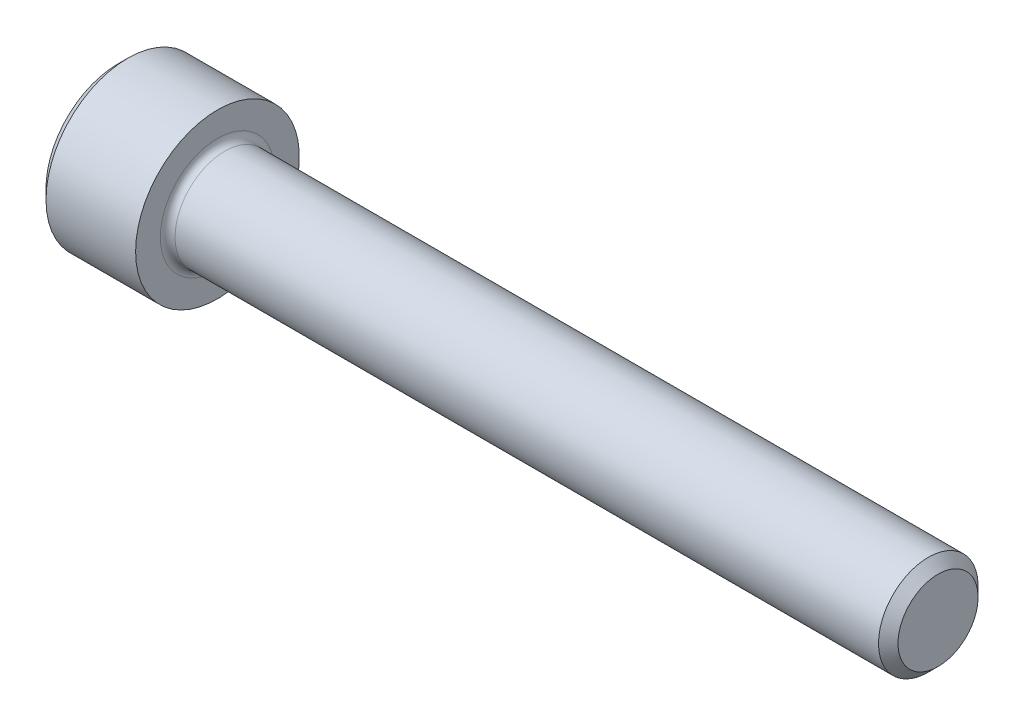
ISO-10303-21;
HEADER;
FILE_DESCRIPTION(('STEP AP214'),'2;1');
FILE_NAME('part.step','',(''),(''),'','','');
FILE_SCHEMA(('AUTOMOTIVE_DESIGN { 1 0 10303 214 1 1 1 1 }'));
ENDSEC;
DATA;
#1=APPLICATION_CONTEXT('core data for automotive mechanical design processes');
#2=APPLICATION_PROTOCOL_DEFINITION('international standard','automotive_design',2000,#1);
#3=PRODUCT_CONTEXT('',#1,'mechanical');
#4=PRODUCT('Part','Part','',(#3));
#5=PRODUCT_RELATED_PRODUCT_CATEGORY('part','',(#4));
#6=PRODUCT_DEFINITION_FORMATION('','',#4);
#7=PRODUCT_DEFINITION_CONTEXT('part definition',#1,'design');
#8=PRODUCT_DEFINITION('design','',#6,#7);
#9=PRODUCT_DEFINITION_SHAPE('','',#8);
#10=(LENGTH_UNIT() NAMED_UNIT(*) SI_UNIT(.MILLI.,.METRE.));
#11=(NAMED_UNIT(*) PLANE_ANGLE_UNIT() SI_UNIT($,.RADIAN.));
#12=(NAMED_UNIT(*) SI_UNIT($,.STERADIAN.) SOLID_ANGLE_UNIT());
#13=UNCERTAINTY_MEASURE_WITH_UNIT(LENGTH_MEASURE(1.E-05),#10,'distance_accuracy_value','');
#14=(GEOMETRIC_REPRESENTATION_CONTEXT(3) GLOBAL_UNCERTAINTY_ASSIGNED_CONTEXT((#13)) GLOBAL_UNIT_ASSIGNED_CONTEXT((#10,
#11,#12)) REPRESENTATION_CONTEXT('',''));
#15=CARTESIAN_POINT('',(0.,0.,0.));
#16=DIRECTION('',(0.,0.,1.));
#17=DIRECTION('',(1.,0.,0.));
#18=AXIS2_PLACEMENT_3D('',#15,#16,#17);
#19=CARTESIAN_POINT('',(2.286,1.14604605784411,1.98501));
#20=DIRECTION('',(-1.,0.,0.));
#21=DIRECTION('',(0.,0.,1.));
#22=AXIS2_PLACEMENT_3D('',#19,#20,#21);
#23=PLANE('',#22);
#24=DIRECTION('',(0.,0.500000000000001,0.866025403784438));
#25=VECTOR('',#24,1.);
#26=CARTESIAN_POINT('',(2.286,-1.71906908676614,0.992505));
#27=LINE('',#26,#25);
#28=CARTESIAN_POINT('',(2.2859999999804,-1.71906908679011,0.992505000013839));
#29=VERTEX_POINT('',#28);
#30=CARTESIAN_POINT('',(2.286,-1.14604605784409,1.98501));
#31=VERTEX_POINT('',#30);
#32=EDGE_CURVE('E101',#29,#31,#27,.T.);
#33=ORIENTED_EDGE('',*,*,#32,.T.);
#34=DIRECTION('',(0.,1.,0.));
#35=VECTOR('',#34,1.);
#36=CARTESIAN_POINT('',(2.286,1.14604605784411,1.98501));
#37=LINE('',#36,#35);
#38=CARTESIAN_POINT('',(2.28599999998701,0.,1.98501000001309));
#39=VERTEX_POINT('',#38);
#40=EDGE_CURVE('E96',#31,#39,#37,.T.);
#41=ORIENTED_EDGE('',*,*,#40,.T.);
#42=CARTESIAN_POINT('',(2.2859999999608,0.,0.));
#43=DIRECTION('',(-1.,0.,0.));
#44=DIRECTION('',(0.,0.,1.));
#45=AXIS2_PLACEMENT_3D('',#42,#43,#44);
#46=CIRCLE('',#45,1.98501000005535);
#47=EDGE_CURVE('E98',#39,#29,#46,.F.);
#48=ORIENTED_EDGE('',*,*,#47,.T.);
#49=EDGE_LOOP('',(#33,#41,#48));
#50=FACE_BOUND('',#49,.T.);
#51=ADVANCED_FACE('F17',(#50),#23,.T.);
#52=CARTESIAN_POINT('',(2.286,1.14604605784411,1.98501));
#53=DIRECTION('',(-1.,0.,0.));
#54=DIRECTION('',(0.,0.,1.));
#55=AXIS2_PLACEMENT_3D('',#52,#53,#54);
#56=PLANE('',#55);
#57=DIRECTION('',(0.,-0.499999999999998,0.86602540378444));
#58=VECTOR('',#57,1.);
#59=CARTESIAN_POINT('',(2.286,-1.71906908676615,-0.992504999999996));
#60=LINE('',#59,#58);
#61=CARTESIAN_POINT('',(2.2859999999804,-1.71906908679012,-0.992505000013836));
#62=VERTEX_POINT('',#61);
#63=CARTESIAN_POINT('',(2.286,-2.29209211568819,0.));
#64=VERTEX_POINT('',#63);
#65=EDGE_CURVE('E105',#62,#64,#60,.T.);
#66=ORIENTED_EDGE('',*,*,#65,.T.);
#67=DIRECTION('',(0.,0.500000000000001,0.866025403784438));
#68=VECTOR('',#67,1.);
#69=CARTESIAN_POINT('',(2.286,-2.29209211568819,0.));
#70=LINE('',#69,#68);
#71=EDGE_CURVE('E172',#64,#29,#70,.T.);
#72=ORIENTED_EDGE('',*,*,#71,.T.);
#73=CARTESIAN_POINT('',(2.2859999999608,0.,0.));
#74=DIRECTION('',(-1.,0.,0.));
#75=DIRECTION('',(0.,0.,1.));
#76=AXIS2_PLACEMENT_3D('',#73,#74,#75);
#77=CIRCLE('',#76,1.98501000005535);
#78=EDGE_CURVE('E117',#29,#62,#77,.F.);
#79=ORIENTED_EDGE('',*,*,#78,.T.);
#80=EDGE_LOOP('',(#66,#72,#79));
#81=FACE_BOUND('',#80,.T.);
#82=ADVANCED_FACE('F348',(#81),#56,.T.);
#83=CARTESIAN_POINT('',(2.286,1.14604605784411,1.98501));
#84=DIRECTION('',(-1.,0.,0.));
#85=DIRECTION('',(0.,0.,1.));
#86=AXIS2_PLACEMENT_3D('',#83,#84,#85);
#87=PLANE('',#86);
#88=DIRECTION('',(0.,1.,0.));
#89=VECTOR('',#88,1.);
#90=CARTESIAN_POINT('',(2.286,1.14604605784411,-1.98501));
#91=LINE('',#90,#89);
#92=CARTESIAN_POINT('',(2.28599999998701,3.76751918419413E-12,-1.98501000001309));
#93=VERTEX_POINT('',#92);
#94=CARTESIAN_POINT('',(2.286,-1.1460460578441,-1.98501));
#95=VERTEX_POINT('',#94);
#96=EDGE_CURVE('E167',#93,#95,#91,.F.);
#97=ORIENTED_EDGE('',*,*,#96,.T.);
#98=DIRECTION('',(0.,-0.499999999999999,0.866025403784439));
#99=VECTOR('',#98,1.);
#100=CARTESIAN_POINT('',(2.286,-1.1460460578441,-1.98501));
#101=LINE('',#100,#99);
#102=EDGE_CURVE('E162',#95,#62,#101,.T.);
#103=ORIENTED_EDGE('',*,*,#102,.T.);
#104=CARTESIAN_POINT('',(2.2859999999608,0.,0.));
#105=DIRECTION('',(-1.,0.,0.));
#106=DIRECTION('',(0.,0.,1.));
#107=AXIS2_PLACEMENT_3D('',#104,#105,#106);
#108=CIRCLE('',#107,1.98501000005535);
#109=EDGE_CURVE('E225',#62,#93,#108,.F.);
#110=ORIENTED_EDGE('',*,*,#109,.T.);
#111=EDGE_LOOP('',(#97,#103,#110));
#112=FACE_BOUND('',#111,.T.);
#113=ADVANCED_FACE('F345',(#112),#87,.T.);
#114=CARTESIAN_POINT('',(2.286,1.14604605784411,1.98501));
#115=DIRECTION('',(-1.,0.,0.));
#116=DIRECTION('',(0.,0.,1.));
#117=AXIS2_PLACEMENT_3D('',#114,#115,#116);
#118=PLANE('',#117);
#119=DIRECTION('',(0.,-0.500000000000001,-0.866025403784438));
#120=VECTOR('',#119,1.);
#121=CARTESIAN_POINT('',(2.286,1.71906908676615,-0.992505000000006));
#122=LINE('',#121,#120);
#123=CARTESIAN_POINT('',(2.2859999999804,1.71906908679012,-0.992505000013843));
#124=VERTEX_POINT('',#123);
#125=CARTESIAN_POINT('',(2.286,1.1460460578441,-1.98501));
#126=VERTEX_POINT('',#125);
#127=EDGE_CURVE('E157',#124,#126,#122,.T.);
#128=ORIENTED_EDGE('',*,*,#127,.T.);
#129=DIRECTION('',(0.,1.,0.));
#130=VECTOR('',#129,1.);
#131=CARTESIAN_POINT('',(2.286,1.14604605784411,-1.98501));
#132=LINE('',#131,#130);
#133=EDGE_CURVE('E152',#126,#93,#132,.F.);
#134=ORIENTED_EDGE('',*,*,#133,.T.);
#135=CARTESIAN_POINT('',(2.2859999999608,0.,0.));
#136=DIRECTION('',(-1.,0.,0.));
#137=DIRECTION('',(0.,0.,1.));
#138=AXIS2_PLACEMENT_3D('',#135,#136,#137);
#139=CIRCLE('',#138,1.98501000005535);
#140=EDGE_CURVE('E222',#93,#124,#139,.F.);
#141=ORIENTED_EDGE('',*,*,#140,.T.);
#142=EDGE_LOOP('',(#128,#134,#141));
#143=FACE_BOUND('',#142,.T.);
#144=ADVANCED_FACE('F341',(#143),#118,.T.);
#145=CARTESIAN_POINT('',(2.286,1.14604605784411,1.98501));
#146=DIRECTION('',(-1.,0.,0.));
#147=DIRECTION('',(0.,0.,1.));
#148=AXIS2_PLACEMENT_3D('',#145,#146,#147);
#149=PLANE('',#148);
#150=DIRECTION('',(0.,0.500000000000002,-0.866025403784437));
#151=VECTOR('',#150,1.);
#152=CARTESIAN_POINT('',(2.286,1.71906908676615,0.992504999999996));
#153=LINE('',#152,#151);
#154=CARTESIAN_POINT('',(2.2859999999804,1.71906908679012,0.992505000013835));
#155=VERTEX_POINT('',#154);
#156=CARTESIAN_POINT('',(2.286,2.2920921156882,0.));
#157=VERTEX_POINT('',#156);
#158=EDGE_CURVE('E147',#155,#157,#153,.T.);
#159=ORIENTED_EDGE('',*,*,#158,.T.);
#160=DIRECTION('',(0.,-0.500000000000002,-0.866025403784437));
#161=VECTOR('',#160,1.);
#162=CARTESIAN_POINT('',(2.286,2.2920921156882,0.));
#163=LINE('',#162,#161);
#164=EDGE_CURVE('E118',#157,#124,#163,.T.);
#165=ORIENTED_EDGE('',*,*,#164,.T.);
#166=CARTESIAN_POINT('',(2.2859999999608,0.,0.));
#167=DIRECTION('',(-1.,0.,0.));
#168=DIRECTION('',(0.,0.,1.));
#169=AXIS2_PLACEMENT_3D('',#166,#167,#168);
#170=CIRCLE('',#169,1.98501000005535);
#171=EDGE_CURVE('E125',#124,#155,#170,.F.);
#172=ORIENTED_EDGE('',*,*,#171,.T.);
#173=EDGE_LOOP('',(#159,#165,#172));
#174=FACE_BOUND('',#173,.T.);
#175=ADVANCED_FACE('F337',(#174),#149,.T.);
#176=CARTESIAN_POINT('',(2.28600000002643,0.,0.));
#177=DIRECTION('',(-1.,0.,0.));
#178=DIRECTION('',(0.,0.,1.));
#179=AXIS2_PLACEMENT_3D('',#176,#177,#178);
#180=CONICAL_SURFACE('',#179,1.98500999994167,1.04719755112655);
#181=CARTESIAN_POINT('',(3.43204605781011,0.,5.6843418860808E-11));
#182=VERTEX_POINT('',#181);
#183=VERTEX_LOOP('',#182);
#184=FACE_BOUND('',#183,.T.);
#185=ORIENTED_EDGE('',*,*,#47,.F.);
#186=CARTESIAN_POINT('',(2.2859999999608,0.,0.));
#187=DIRECTION('',(-1.,0.,0.));
#188=DIRECTION('',(0.,0.,1.));
#189=AXIS2_PLACEMENT_3D('',#186,#187,#188);
#190=CIRCLE('',#189,1.98501000005535);
#191=EDGE_CURVE('E113',#155,#39,#190,.F.);
#192=ORIENTED_EDGE('',*,*,#191,.F.);
#193=ORIENTED_EDGE('',*,*,#171,.F.);
#194=ORIENTED_EDGE('',*,*,#140,.F.);
#195=ORIENTED_EDGE('',*,*,#109,.F.);
#196=ORIENTED_EDGE('',*,*,#78,.F.);
#197=EDGE_LOOP('',(#185,#192,#193,#194,#195,#196));
#198=FACE_BOUND('',#197,.T.);
#199=ADVANCED_FACE('F111',(#184,#198),#180,.F.);
#200=CARTESIAN_POINT('',(2.286,1.14604605784411,1.98501));
#201=DIRECTION('',(-1.,0.,0.));
#202=DIRECTION('',(0.,0.,1.));
#203=AXIS2_PLACEMENT_3D('',#200,#201,#202);
#204=PLANE('',#203);
#205=DIRECTION('',(0.,-1.,0.));
#206=VECTOR('',#205,1.);
#207=CARTESIAN_POINT('',(2.286,-1.14604605784409,1.98501));
#208=LINE('',#207,#206);
#209=CARTESIAN_POINT('',(2.286,1.14604605784411,1.98501));
#210=VERTEX_POINT('',#209);
#211=EDGE_CURVE('E122',#39,#210,#208,.F.);
#212=ORIENTED_EDGE('',*,*,#211,.T.);
#213=DIRECTION('',(0.,0.499999999999998,-0.86602540378444));
#214=VECTOR('',#213,1.);
#215=CARTESIAN_POINT('',(2.286,2.2920921156882,0.));
#216=LINE('',#215,#214);
#217=EDGE_CURVE('E124',#155,#210,#216,.F.);
#218=ORIENTED_EDGE('',*,*,#217,.F.);
#219=ORIENTED_EDGE('',*,*,#191,.T.);
#220=EDGE_LOOP('',(#212,#218,#219));
#221=FACE_BOUND('',#220,.T.);
#222=ADVANCED_FACE('F121',(#221),#204,.T.);
#223=CARTESIAN_POINT('',(2.286,2.2920921156882,0.));
#224=DIRECTION('',(0.,-0.86602540378444,-0.499999999999998));
#225=DIRECTION('',(0.,0.499999999999998,-0.86602540378444));
#226=AXIS2_PLACEMENT_3D('',#223,#224,#225);
#227=PLANE('',#226);
#228=ORIENTED_EDGE('',*,*,#217,.T.);
#229=DIRECTION('',(1.,0.,0.));
#230=VECTOR('',#229,1.);
#231=CARTESIAN_POINT('',(2.286,1.14604605784411,1.98501));
#232=LINE('',#231,#230);
#233=CARTESIAN_POINT('',(0.,1.14604605784411,1.98501));
#234=VERTEX_POINT('',#233);
#235=EDGE_CURVE('E130',#210,#234,#232,.F.);
#236=ORIENTED_EDGE('',*,*,#235,.T.);
#237=DIRECTION('',(0.,-0.499999999999998,0.86602540378444));
#238=VECTOR('',#237,1.);
#239=CARTESIAN_POINT('',(0.,2.2920921156882,0.));
#240=LINE('',#239,#238);
#241=CARTESIAN_POINT('',(0.,2.2920921156882,0.));
#242=VERTEX_POINT('',#241);
#243=EDGE_CURVE('E137',#242,#234,#240,.T.);
#244=ORIENTED_EDGE('',*,*,#243,.F.);
#245=DIRECTION('',(1.,0.,0.));
#246=VECTOR('',#245,1.);
#247=CARTESIAN_POINT('',(2.286,2.2920921156882,0.));
#248=LINE('',#247,#246);
#249=EDGE_CURVE('E187',#242,#157,#248,.T.);
#250=ORIENTED_EDGE('',*,*,#249,.T.);
#251=ORIENTED_EDGE('',*,*,#158,.F.);
#252=EDGE_LOOP('',(#228,#236,#244,#250,#251));
#253=FACE_BOUND('',#252,.T.);
#254=ADVANCED_FACE('F329',(#253),#227,.T.);
#255=CARTESIAN_POINT('',(2.286,-1.14604605784409,1.98501));
#256=DIRECTION('',(0.,0.,1.));
#257=DIRECTION('',(0.,-1.,0.));
#258=AXIS2_PLACEMENT_3D('',#255,#256,#257);
#259=PLANE('',#258);
#260=ORIENTED_EDGE('',*,*,#235,.F.);
#261=ORIENTED_EDGE('',*,*,#211,.F.);
#262=ORIENTED_EDGE('',*,*,#40,.F.);
#263=DIRECTION('',(1.,0.,0.));
#264=VECTOR('',#263,1.);
#265=CARTESIAN_POINT('',(2.286,-1.14604605784409,1.98501));
#266=LINE('',#265,#264);
#267=CARTESIAN_POINT('',(0.,-1.14604605784409,1.98501));
#268=VERTEX_POINT('',#267);
#269=EDGE_CURVE('E132',#268,#31,#266,.T.);
#270=ORIENTED_EDGE('',*,*,#269,.F.);
#271=DIRECTION('',(0.,1.,0.));
#272=VECTOR('',#271,1.);
#273=CARTESIAN_POINT('',(0.,0.,1.98501));
#274=LINE('',#273,#272);
#275=EDGE_CURVE('E363',#234,#268,#274,.F.);
#276=ORIENTED_EDGE('',*,*,#275,.F.);
#277=EDGE_LOOP('',(#260,#261,#262,#270,#276));
#278=FACE_BOUND('',#277,.T.);
#279=ADVANCED_FACE('F128',(#278),#259,.F.);
#280=CARTESIAN_POINT('',(2.286,-1.14604605784409,1.98501));
#281=DIRECTION('',(0.,0.866025403784438,-0.500000000000001));
#282=DIRECTION('',(0.,0.500000000000001,0.866025403784438));
#283=AXIS2_PLACEMENT_3D('',#280,#281,#282);
#284=PLANE('',#283);
#285=ORIENTED_EDGE('',*,*,#71,.F.);
#286=DIRECTION('',(1.,0.,0.));
#287=VECTOR('',#286,1.);
#288=CARTESIAN_POINT('',(2.286,-2.29209211568819,0.));
#289=LINE('',#288,#287);
#290=CARTESIAN_POINT('',(0.,-2.29209211568819,0.));
#291=VERTEX_POINT('',#290);
#292=EDGE_CURVE('E198',#291,#64,#289,.T.);
#293=ORIENTED_EDGE('',*,*,#292,.F.);
#294=DIRECTION('',(0.,-0.500000000000001,-0.866025403784438));
#295=VECTOR('',#294,1.);
#296=CARTESIAN_POINT('',(0.,-1.14604605784409,1.98501));
#297=LINE('',#296,#295);
#298=EDGE_CURVE('E361',#268,#291,#297,.T.);
#299=ORIENTED_EDGE('',*,*,#298,.F.);
#300=ORIENTED_EDGE('',*,*,#269,.T.);
#301=ORIENTED_EDGE('',*,*,#32,.F.);
#302=EDGE_LOOP('',(#285,#293,#299,#300,#301));
#303=FACE_BOUND('',#302,.T.);
#304=ADVANCED_FACE('F322',(#303),#284,.T.);
#305=CARTESIAN_POINT('',(2.286,-2.29209211568819,0.));
#306=DIRECTION('',(0.,0.866025403784439,0.499999999999999));
#307=DIRECTION('',(0.,-0.499999999999999,0.866025403784439));
#308=AXIS2_PLACEMENT_3D('',#305,#306,#307);
#309=PLANE('',#308);
#310=ORIENTED_EDGE('',*,*,#102,.F.);
#311=DIRECTION('',(1.,0.,0.));
#312=VECTOR('',#311,1.);
#313=CARTESIAN_POINT('',(2.286,-1.1460460578441,-1.98501));
#314=LINE('',#313,#312);
#315=CARTESIAN_POINT('',(0.,-1.1460460578441,-1.98501));
#316=VERTEX_POINT('',#315);
#317=EDGE_CURVE('E191',#95,#316,#314,.F.);
#318=ORIENTED_EDGE('',*,*,#317,.T.);
#319=DIRECTION('',(0.,0.499999999999999,-0.86602540378444));
#320=VECTOR('',#319,1.);
#321=CARTESIAN_POINT('',(0.,-2.29209211568819,0.));
#322=LINE('',#321,#320);
#323=EDGE_CURVE('E358',#291,#316,#322,.T.);
#324=ORIENTED_EDGE('',*,*,#323,.F.);
#325=ORIENTED_EDGE('',*,*,#292,.T.);
#326=ORIENTED_EDGE('',*,*,#65,.F.);
#327=EDGE_LOOP('',(#310,#318,#324,#325,#326));
#328=FACE_BOUND('',#327,.T.);
#329=ADVANCED_FACE('F318',(#328),#309,.T.);
#330=CARTESIAN_POINT('',(2.286,1.1460460578441,-1.98501));
#331=DIRECTION('',(0.,0.,-1.));
#332=DIRECTION('',(0.,1.,0.));
#333=AXIS2_PLACEMENT_3D('',#330,#331,#332);
#334=PLANE('',#333);
#335=ORIENTED_EDGE('',*,*,#317,.F.);
#336=ORIENTED_EDGE('',*,*,#96,.F.);
#337=ORIENTED_EDGE('',*,*,#133,.F.);
#338=DIRECTION('',(1.,0.,0.));
#339=VECTOR('',#338,1.);
#340=CARTESIAN_POINT('',(2.286,1.1460460578441,-1.98501));
#341=LINE('',#340,#339);
#342=CARTESIAN_POINT('',(0.,1.1460460578441,-1.98501));
#343=VERTEX_POINT('',#342);
#344=EDGE_CURVE('E190',#126,#343,#341,.F.);
#345=ORIENTED_EDGE('',*,*,#344,.T.);
#346=DIRECTION('',(0.,1.,0.));
#347=VECTOR('',#346,1.);
#348=CARTESIAN_POINT('',(0.,0.,-1.98501));
#349=LINE('',#348,#347);
#350=EDGE_CURVE('E373',#316,#343,#349,.T.);
#351=ORIENTED_EDGE('',*,*,#350,.F.);
#352=EDGE_LOOP('',(#335,#336,#337,#345,#351));
#353=FACE_BOUND('',#352,.T.);
#354=ADVANCED_FACE('F314',(#353),#334,.F.);
#355=CARTESIAN_POINT('',(2.286,2.2920921156882,0.));
#356=DIRECTION('',(0.,0.866025403784438,-0.500000000000002));
#357=DIRECTION('',(0.,0.500000000000002,0.866025403784438));
#358=AXIS2_PLACEMENT_3D('',#355,#356,#357);
#359=PLANE('',#358);
#360=ORIENTED_EDGE('',*,*,#344,.F.);
#361=ORIENTED_EDGE('',*,*,#127,.F.);
#362=ORIENTED_EDGE('',*,*,#164,.F.);
#363=ORIENTED_EDGE('',*,*,#249,.F.);
#364=DIRECTION('',(0.,0.500000000000002,0.866025403784438));
#365=VECTOR('',#364,1.);
#366=CARTESIAN_POINT('',(0.,1.1460460578441,-1.98501));
#367=LINE('',#366,#365);
#368=EDGE_CURVE('E218',#343,#242,#367,.T.);
#369=ORIENTED_EDGE('',*,*,#368,.F.);
#370=EDGE_LOOP('',(#360,#361,#362,#363,#369));
#371=FACE_BOUND('',#370,.T.);
#372=ADVANCED_FACE('F310',(#371),#359,.F.);
#373=CARTESIAN_POINT('',(0.,0.,0.));
#374=DIRECTION('',(-1.,0.,0.));
#375=DIRECTION('',(0.,0.,1.));
#376=AXIS2_PLACEMENT_3D('',#373,#374,#375);
#377=PLANE('',#376);
#378=CARTESIAN_POINT('',(0.,0.,0.));
#379=DIRECTION('',(1.,0.,0.));
#380=DIRECTION('',(0.,1.,0.));
#381=AXIS2_PLACEMENT_3D('',#378,#379,#380);
#382=CIRCLE('',#381,3.48615000007158);
#383=CARTESIAN_POINT('',(0.,3.48615000007158,0.));
#384=VERTEX_POINT('',#383);
#385=EDGE_CURVE('E216',#384,#384,#382,.T.);
#386=ORIENTED_EDGE('',*,*,#385,.F.);
#387=EDGE_LOOP('',(#386));
#388=FACE_BOUND('',#387,.T.);
#389=ORIENTED_EDGE('',*,*,#350,.T.);
#390=ORIENTED_EDGE('',*,*,#368,.T.);
#391=ORIENTED_EDGE('',*,*,#243,.T.);
#392=ORIENTED_EDGE('',*,*,#275,.T.);
#393=ORIENTED_EDGE('',*,*,#298,.T.);
#394=ORIENTED_EDGE('',*,*,#323,.T.);
#395=EDGE_LOOP('',(#389,#390,#391,#392,#393,#394));
#396=FACE_BOUND('',#395,.T.);
#397=ADVANCED_FACE('F302',(#388,#396),#377,.T.);
#398=CARTESIAN_POINT('',(0.482599999998001,0.,0.));
#399=DIRECTION('',(1.,0.,0.));
#400=DIRECTION('',(0.,1.,0.));
#401=AXIS2_PLACEMENT_3D('',#398,#399,#400);
#402=CONICAL_SURFACE('',#401,3.96875000001273,0.785398163338555);
#403=ORIENTED_EDGE('',*,*,#385,.T.);
#404=EDGE_LOOP('',(#403));
#405=FACE_BOUND('',#404,.T.);
#406=CARTESIAN_POINT('',(0.4826,0.,0.));
#407=DIRECTION('',(-1.,0.,0.));
#408=DIRECTION('',(0.,0.,1.));
#409=AXIS2_PLACEMENT_3D('',#406,#407,#408);
#410=CIRCLE('',#409,3.96875);
#411=CARTESIAN_POINT('',(0.4826,0.,3.96875));
#412=VERTEX_POINT('',#411);
#413=EDGE_CURVE('E215',#412,#412,#410,.F.);
#414=ORIENTED_EDGE('',*,*,#413,.F.);
#415=EDGE_LOOP('',(#414));
#416=FACE_BOUND('',#415,.T.);
#417=ADVANCED_FACE('F297',(#405,#416),#402,.T.);
#418=CARTESIAN_POINT('',(-31.75,0.,0.));
#419=DIRECTION('',(-1.,0.,0.));
#420=DIRECTION('',(0.,0.,1.));
#421=AXIS2_PLACEMENT_3D('',#418,#419,#420);
#422=CYLINDRICAL_SURFACE('',#421,3.96875);
#423=CARTESIAN_POINT('',(4.826,0.,0.));
#424=DIRECTION('',(-1.,0.,0.));
#425=DIRECTION('',(0.,0.,1.));
#426=AXIS2_PLACEMENT_3D('',#423,#424,#425);
#427=CIRCLE('',#426,3.96875);
#428=CARTESIAN_POINT('',(4.826,0.,3.96875));
#429=VERTEX_POINT('',#428);
#430=EDGE_CURVE('E212',#429,#429,#427,.F.);
#431=ORIENTED_EDGE('',*,*,#430,.F.);
#432=EDGE_LOOP('',(#431));
#433=FACE_BOUND('',#432,.T.);
#434=ORIENTED_EDGE('',*,*,#413,.T.);
#435=EDGE_LOOP('',(#434));
#436=FACE_BOUND('',#435,.T.);
#437=ADVANCED_FACE('F293',(#433,#436),#422,.T.);
#438=CARTESIAN_POINT('',(39.751,1.94056,0.));
#439=DIRECTION('',(1.,0.,0.));
#440=DIRECTION('',(0.,0.,-1.));
#441=AXIS2_PLACEMENT_3D('',#438,#439,#440);
#442=PLANE('',#441);
#443=CARTESIAN_POINT('',(39.750999999967,0.,0.));
#444=DIRECTION('',(-1.,0.,0.));
#445=DIRECTION('',(0.,0.,1.));
#446=AXIS2_PLACEMENT_3D('',#443,#444,#445);
#447=CIRCLE('',#446,1.94056000003684);
#448=CARTESIAN_POINT('',(39.750999999967,0.,1.94056000003684));
#449=VERTEX_POINT('',#448);
#450=EDGE_CURVE('E208',#449,#449,#447,.T.);
#451=ORIENTED_EDGE('',*,*,#450,.F.);
#452=EDGE_LOOP('',(#451));
#453=FACE_BOUND('',#452,.T.);
#454=ADVANCED_FACE('F251',(#453),#442,.T.);
#455=CARTESIAN_POINT('',(4.826,3.96875,0.));
#456=DIRECTION('',(1.,0.,0.));
#457=DIRECTION('',(0.,0.,-1.));
#458=AXIS2_PLACEMENT_3D('',#455,#456,#457);
#459=PLANE('',#458);
#460=ORIENTED_EDGE('',*,*,#430,.T.);
#461=EDGE_LOOP('',(#460));
#462=FACE_BOUND('',#461,.T.);
#463=CARTESIAN_POINT('',(4.826,0.,0.));
#464=DIRECTION('',(1.,0.,0.));
#465=DIRECTION('',(0.,0.,1.));
#466=AXIS2_PLACEMENT_3D('',#463,#464,#465);
#467=CIRCLE('',#466,2.7686);
#468=CARTESIAN_POINT('',(4.826,0.,-2.7686));
#469=VERTEX_POINT('',#468);
#470=CARTESIAN_POINT('',(4.826,0.,2.7686));
#471=VERTEX_POINT('',#470);
#472=EDGE_CURVE('E211',#469,#471,#467,.F.);
#473=ORIENTED_EDGE('',*,*,#472,.T.);
#474=CARTESIAN_POINT('',(4.826,0.,0.));
#475=DIRECTION('',(1.,0.,0.));
#476=DIRECTION('',(0.,0.,-1.));
#477=AXIS2_PLACEMENT_3D('',#474,#475,#476);
#478=CIRCLE('',#477,2.7686);
#479=EDGE_CURVE('E36',#471,#469,#478,.F.);
#480=ORIENTED_EDGE('',*,*,#479,.T.);
#481=EDGE_LOOP('',(#473,#480));
#482=FACE_BOUND('',#481,.T.);
#483=ADVANCED_FACE('F232',(#462,#482),#459,.T.);
#484=CARTESIAN_POINT('',(39.2785600000138,0.,0.));
#485=DIRECTION('',(-1.,0.,0.));
#486=DIRECTION('',(0.,0.,1.));
#487=AXIS2_PLACEMENT_3D('',#484,#485,#486);
#488=CONICAL_SURFACE('',#487,2.41299999993316,0.785398163337289);
#489=CARTESIAN_POINT('',(39.27856,0.,0.));
#490=DIRECTION('',(-1.,0.,0.));
#491=DIRECTION('',(0.,0.,1.));
#492=AXIS2_PLACEMENT_3D('',#489,#490,#491);
#493=CIRCLE('',#492,2.413);
#494=CARTESIAN_POINT('',(39.27856,0.,2.413));
#495=VERTEX_POINT('',#494);
#496=EDGE_CURVE('E28',#495,#495,#493,.T.);
#497=ORIENTED_EDGE('',*,*,#496,.F.);
#498=EDGE_LOOP('',(#497));
#499=FACE_BOUND('',#498,.T.);
#500=ORIENTED_EDGE('',*,*,#450,.T.);
#501=EDGE_LOOP('',(#500));
#502=FACE_BOUND('',#501,.T.);
#503=ADVANCED_FACE('F250',(#499,#502),#488,.T.);
#504=CARTESIAN_POINT('',(5.1816,0.,0.));
#505=DIRECTION('',(1.,0.,0.));
#506=DIRECTION('',(0.,0.,-1.));
#507=AXIS2_PLACEMENT_3D('',#504,#505,#506);
#508=TOROIDAL_SURFACE('',#507,2.7686,0.3556);
#509=CARTESIAN_POINT('',(5.1816,0.,0.));
#510=DIRECTION('',(-1.,0.,0.));
#511=DIRECTION('',(0.,0.,1.));
#512=AXIS2_PLACEMENT_3D('',#509,#510,#511);
#513=CIRCLE('',#512,2.413);
#514=CARTESIAN_POINT('',(5.1816,0.,2.413));
#515=VERTEX_POINT('',#514);
#516=EDGE_CURVE('E11',#515,#515,#513,.F.);
#517=ORIENTED_EDGE('',*,*,#516,.F.);
#518=EDGE_LOOP('',(#517));
#519=FACE_BOUND('',#518,.T.);
#520=ORIENTED_EDGE('',*,*,#472,.F.);
#521=ORIENTED_EDGE('',*,*,#479,.F.);
#522=EDGE_LOOP('',(#520,#521));
#523=FACE_BOUND('',#522,.T.);
#524=ADVANCED_FACE('F229',(#519,#523),#508,.F.);
#525=CARTESIAN_POINT('',(-31.75,0.,0.));
#526=DIRECTION('',(-1.,0.,0.));
#527=DIRECTION('',(0.,0.,1.));
#528=AXIS2_PLACEMENT_3D('',#525,#526,#527);
#529=CYLINDRICAL_SURFACE('',#528,2.413);
#530=ORIENTED_EDGE('',*,*,#516,.T.);
#531=EDGE_LOOP('',(#530));
#532=FACE_BOUND('',#531,.T.);
#533=ORIENTED_EDGE('',*,*,#496,.T.);
#534=EDGE_LOOP('',(#533));
#535=FACE_BOUND('',#534,.T.);
#536=ADVANCED_FACE('F275',(#532,#535),#529,.T.);
#537=CLOSED_SHELL('',(#51,#82,#113,#144,#175,#199,#222,#254,#279,#304,#329,#354,#372,#397,#417,
#437,#454,#483,#503,#524,#536));
#538=MANIFOLD_SOLID_BREP('B1',#537);
#539=ADVANCED_BREP_SHAPE_REPRESENTATION('',(#18,#538),#14);
#540=SHAPE_DEFINITION_REPRESENTATION(#9,#539);
ENDSEC;
END-ISO-10303-21;
